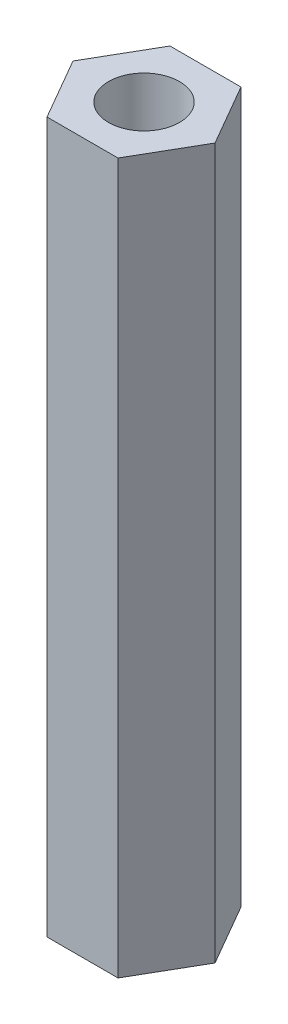
ISO-10303-21;
HEADER;
FILE_DESCRIPTION(('STEP AP214'),'2;1');
FILE_NAME('part.step','',(''),(''),'','','');
FILE_SCHEMA(('AUTOMOTIVE_DESIGN { 1 0 10303 214 1 1 1 1 }'));
ENDSEC;
DATA;
#1=APPLICATION_CONTEXT('core data for automotive mechanical design processes');
#2=APPLICATION_PROTOCOL_DEFINITION('international standard','automotive_design',2000,#1);
#3=PRODUCT_CONTEXT('',#1,'mechanical');
#4=PRODUCT('Part','Part','',(#3));
#5=PRODUCT_RELATED_PRODUCT_CATEGORY('part','',(#4));
#6=PRODUCT_DEFINITION_FORMATION('','',#4);
#7=PRODUCT_DEFINITION_CONTEXT('part definition',#1,'design');
#8=PRODUCT_DEFINITION('design','',#6,#7);
#9=PRODUCT_DEFINITION_SHAPE('','',#8);
#10=(LENGTH_UNIT() NAMED_UNIT(*) SI_UNIT(.MILLI.,.METRE.));
#11=(NAMED_UNIT(*) PLANE_ANGLE_UNIT() SI_UNIT($,.RADIAN.));
#12=(NAMED_UNIT(*) SI_UNIT($,.STERADIAN.) SOLID_ANGLE_UNIT());
#13=UNCERTAINTY_MEASURE_WITH_UNIT(LENGTH_MEASURE(1.E-05),#10,'distance_accuracy_value','');
#14=(GEOMETRIC_REPRESENTATION_CONTEXT(3) GLOBAL_UNCERTAINTY_ASSIGNED_CONTEXT((#13)) GLOBAL_UNIT_ASSIGNED_CONTEXT((#10,
#11,#12)) REPRESENTATION_CONTEXT('',''));
#15=CARTESIAN_POINT('',(0.,0.,0.));
#16=DIRECTION('',(0.,0.,1.));
#17=DIRECTION('',(1.,0.,0.));
#18=AXIS2_PLACEMENT_3D('',#15,#16,#17);
#19=CARTESIAN_POINT('',(0.,30.,0.));
#20=DIRECTION('',(0.,1.,0.));
#21=DIRECTION('',(0.,0.,1.));
#22=AXIS2_PLACEMENT_3D('',#19,#20,#21);
#23=PLANE('',#22);
#24=DIRECTION('',(-0.5,0.,-0.866025403784439));
#25=VECTOR('',#24,1.);
#26=CARTESIAN_POINT('',(3.,30.,0.));
#27=LINE('',#26,#25);
#28=CARTESIAN_POINT('',(3.,30.,0.));
#29=VERTEX_POINT('',#28);
#30=CARTESIAN_POINT('',(1.5,30.,-2.59807621135332));
#31=VERTEX_POINT('',#30);
#32=EDGE_CURVE('E152',#29,#31,#27,.T.);
#33=ORIENTED_EDGE('',*,*,#32,.T.);
#34=DIRECTION('',(-1.,0.,0.));
#35=VECTOR('',#34,1.);
#36=CARTESIAN_POINT('',(1.5,30.,-2.59807621135332));
#37=LINE('',#36,#35);
#38=CARTESIAN_POINT('',(-1.5,30.,-2.59807621135332));
#39=VERTEX_POINT('',#38);
#40=EDGE_CURVE('E100',#31,#39,#37,.T.);
#41=ORIENTED_EDGE('',*,*,#40,.T.);
#42=DIRECTION('',(-0.5,0.,0.866025403784439));
#43=VECTOR('',#42,1.);
#44=CARTESIAN_POINT('',(-1.5,30.,-2.59807621135332));
#45=LINE('',#44,#43);
#46=CARTESIAN_POINT('',(-3.,30.,0.));
#47=VERTEX_POINT('',#46);
#48=EDGE_CURVE('E113',#39,#47,#45,.T.);
#49=ORIENTED_EDGE('',*,*,#48,.T.);
#50=DIRECTION('',(0.5,0.,0.866025403784438));
#51=VECTOR('',#50,1.);
#52=CARTESIAN_POINT('',(-3.,30.,0.));
#53=LINE('',#52,#51);
#54=CARTESIAN_POINT('',(-1.5,30.,2.59807621135332));
#55=VERTEX_POINT('',#54);
#56=EDGE_CURVE('E107',#47,#55,#53,.T.);
#57=ORIENTED_EDGE('',*,*,#56,.T.);
#58=DIRECTION('',(1.,0.,0.));
#59=VECTOR('',#58,1.);
#60=CARTESIAN_POINT('',(-1.5,30.,2.59807621135332));
#61=LINE('',#60,#59);
#62=CARTESIAN_POINT('',(1.5,30.,2.59807621135332));
#63=VERTEX_POINT('',#62);
#64=EDGE_CURVE('E111',#55,#63,#61,.T.);
#65=ORIENTED_EDGE('',*,*,#64,.T.);
#66=DIRECTION('',(0.5,0.,-0.866025403784439));
#67=VECTOR('',#66,1.);
#68=CARTESIAN_POINT('',(1.5,30.,2.59807621135332));
#69=LINE('',#68,#67);
#70=EDGE_CURVE('E63',#63,#29,#69,.T.);
#71=ORIENTED_EDGE('',*,*,#70,.T.);
#72=EDGE_LOOP('',(#33,#41,#49,#57,#65,#71));
#73=FACE_BOUND('',#72,.T.);
#74=CARTESIAN_POINT('',(0.,30.,0.));
#75=DIRECTION('',(0.,1.,0.));
#76=DIRECTION('',(0.,0.,1.));
#77=AXIS2_PLACEMENT_3D('',#74,#75,#76);
#78=CIRCLE('',#77,1.5);
#79=CARTESIAN_POINT('',(0.,30.,1.5));
#80=VERTEX_POINT('',#79);
#81=EDGE_CURVE('E140',#80,#80,#78,.T.);
#82=ORIENTED_EDGE('',*,*,#81,.F.);
#83=EDGE_LOOP('',(#82));
#84=FACE_BOUND('',#83,.T.);
#85=ADVANCED_FACE('F45',(#73,#84),#23,.T.);
#86=CARTESIAN_POINT('',(0.,0.,0.));
#87=DIRECTION('',(0.,1.,0.));
#88=DIRECTION('',(0.,0.,1.));
#89=AXIS2_PLACEMENT_3D('',#86,#87,#88);
#90=PLANE('',#89);
#91=DIRECTION('',(-0.5,0.,-0.866025403784439));
#92=VECTOR('',#91,1.);
#93=CARTESIAN_POINT('',(3.,0.,0.));
#94=LINE('',#93,#92);
#95=CARTESIAN_POINT('',(3.,0.,0.));
#96=VERTEX_POINT('',#95);
#97=CARTESIAN_POINT('',(1.5,0.,-2.59807621135332));
#98=VERTEX_POINT('',#97);
#99=EDGE_CURVE('E135',#96,#98,#94,.T.);
#100=ORIENTED_EDGE('',*,*,#99,.F.);
#101=DIRECTION('',(0.5,0.,-0.866025403784439));
#102=VECTOR('',#101,1.);
#103=CARTESIAN_POINT('',(1.5,0.,2.59807621135332));
#104=LINE('',#103,#102);
#105=CARTESIAN_POINT('',(1.5,0.,2.59807621135332));
#106=VERTEX_POINT('',#105);
#107=EDGE_CURVE('E92',#106,#96,#104,.T.);
#108=ORIENTED_EDGE('',*,*,#107,.F.);
#109=DIRECTION('',(1.,0.,0.));
#110=VECTOR('',#109,1.);
#111=CARTESIAN_POINT('',(-1.5,0.,2.59807621135332));
#112=LINE('',#111,#110);
#113=CARTESIAN_POINT('',(-1.5,0.,2.59807621135332));
#114=VERTEX_POINT('',#113);
#115=EDGE_CURVE('E86',#114,#106,#112,.T.);
#116=ORIENTED_EDGE('',*,*,#115,.F.);
#117=DIRECTION('',(0.5,0.,0.866025403784438));
#118=VECTOR('',#117,1.);
#119=CARTESIAN_POINT('',(-3.,0.,0.));
#120=LINE('',#119,#118);
#121=CARTESIAN_POINT('',(-3.,0.,0.));
#122=VERTEX_POINT('',#121);
#123=EDGE_CURVE('E122',#122,#114,#120,.T.);
#124=ORIENTED_EDGE('',*,*,#123,.F.);
#125=DIRECTION('',(-0.5,0.,0.866025403784439));
#126=VECTOR('',#125,1.);
#127=CARTESIAN_POINT('',(-1.5,0.,-2.59807621135332));
#128=LINE('',#127,#126);
#129=CARTESIAN_POINT('',(-1.5,0.,-2.59807621135332));
#130=VERTEX_POINT('',#129);
#131=EDGE_CURVE('E143',#130,#122,#128,.T.);
#132=ORIENTED_EDGE('',*,*,#131,.F.);
#133=DIRECTION('',(-1.,0.,0.));
#134=VECTOR('',#133,1.);
#135=CARTESIAN_POINT('',(1.5,0.,-2.59807621135332));
#136=LINE('',#135,#134);
#137=EDGE_CURVE('E139',#98,#130,#136,.T.);
#138=ORIENTED_EDGE('',*,*,#137,.F.);
#139=EDGE_LOOP('',(#100,#108,#116,#124,#132,#138));
#140=FACE_BOUND('',#139,.T.);
#141=CARTESIAN_POINT('',(0.,0.,0.));
#142=DIRECTION('',(0.,1.,0.));
#143=DIRECTION('',(0.,0.,1.));
#144=AXIS2_PLACEMENT_3D('',#141,#142,#143);
#145=CIRCLE('',#144,1.5);
#146=CARTESIAN_POINT('',(0.,0.,1.5));
#147=VERTEX_POINT('',#146);
#148=EDGE_CURVE('E249',#147,#147,#145,.T.);
#149=ORIENTED_EDGE('',*,*,#148,.T.);
#150=EDGE_LOOP('',(#149));
#151=FACE_BOUND('',#150,.T.);
#152=ADVANCED_FACE('F165',(#140,#151),#90,.F.);
#153=CARTESIAN_POINT('',(3.,30.,0.));
#154=DIRECTION('',(-0.866025403784439,0.,0.5));
#155=DIRECTION('',(0.5,0.,0.866025403784439));
#156=AXIS2_PLACEMENT_3D('',#153,#154,#155);
#157=PLANE('',#156);
#158=ORIENTED_EDGE('',*,*,#99,.T.);
#159=DIRECTION('',(0.,-1.,0.));
#160=VECTOR('',#159,1.);
#161=CARTESIAN_POINT('',(1.5,30.,-2.59807621135332));
#162=LINE('',#161,#160);
#163=EDGE_CURVE('E11',#31,#98,#162,.T.);
#164=ORIENTED_EDGE('',*,*,#163,.F.);
#165=ORIENTED_EDGE('',*,*,#32,.F.);
#166=DIRECTION('',(0.,-1.,0.));
#167=VECTOR('',#166,1.);
#168=CARTESIAN_POINT('',(3.,30.,0.));
#169=LINE('',#168,#167);
#170=EDGE_CURVE('E131',#29,#96,#169,.T.);
#171=ORIENTED_EDGE('',*,*,#170,.T.);
#172=EDGE_LOOP('',(#158,#164,#165,#171));
#173=FACE_BOUND('',#172,.T.);
#174=ADVANCED_FACE('F47',(#173),#157,.F.);
#175=CARTESIAN_POINT('',(1.5,30.,-2.59807621135332));
#176=DIRECTION('',(0.,0.,1.));
#177=DIRECTION('',(1.,0.,0.));
#178=AXIS2_PLACEMENT_3D('',#175,#176,#177);
#179=PLANE('',#178);
#180=ORIENTED_EDGE('',*,*,#137,.T.);
#181=DIRECTION('',(0.,-1.,0.));
#182=VECTOR('',#181,1.);
#183=CARTESIAN_POINT('',(-1.5,30.,-2.59807621135332));
#184=LINE('',#183,#182);
#185=EDGE_CURVE('E55',#39,#130,#184,.T.);
#186=ORIENTED_EDGE('',*,*,#185,.F.);
#187=ORIENTED_EDGE('',*,*,#40,.F.);
#188=ORIENTED_EDGE('',*,*,#163,.T.);
#189=EDGE_LOOP('',(#180,#186,#187,#188));
#190=FACE_BOUND('',#189,.T.);
#191=ADVANCED_FACE('F190',(#190),#179,.F.);
#192=CARTESIAN_POINT('',(-1.5,30.,-2.59807621135332));
#193=DIRECTION('',(0.866025403784439,0.,0.5));
#194=DIRECTION('',(0.5,0.,-0.866025403784439));
#195=AXIS2_PLACEMENT_3D('',#192,#193,#194);
#196=PLANE('',#195);
#197=ORIENTED_EDGE('',*,*,#131,.T.);
#198=DIRECTION('',(0.,-1.,0.));
#199=VECTOR('',#198,1.);
#200=CARTESIAN_POINT('',(-3.,30.,0.));
#201=LINE('',#200,#199);
#202=EDGE_CURVE('E124',#47,#122,#201,.T.);
#203=ORIENTED_EDGE('',*,*,#202,.F.);
#204=ORIENTED_EDGE('',*,*,#48,.F.);
#205=ORIENTED_EDGE('',*,*,#185,.T.);
#206=EDGE_LOOP('',(#197,#203,#204,#205));
#207=FACE_BOUND('',#206,.T.);
#208=ADVANCED_FACE('F162',(#207),#196,.F.);
#209=CARTESIAN_POINT('',(-3.,30.,0.));
#210=DIRECTION('',(0.866025403784438,0.,-0.5));
#211=DIRECTION('',(-0.500000000000001,0.,-0.866025403784438));
#212=AXIS2_PLACEMENT_3D('',#209,#210,#211);
#213=PLANE('',#212);
#214=ORIENTED_EDGE('',*,*,#123,.T.);
#215=DIRECTION('',(0.,-1.,0.));
#216=VECTOR('',#215,1.);
#217=CARTESIAN_POINT('',(-1.5,30.,2.59807621135332));
#218=LINE('',#217,#216);
#219=EDGE_CURVE('E119',#55,#114,#218,.T.);
#220=ORIENTED_EDGE('',*,*,#219,.F.);
#221=ORIENTED_EDGE('',*,*,#56,.F.);
#222=ORIENTED_EDGE('',*,*,#202,.T.);
#223=EDGE_LOOP('',(#214,#220,#221,#222));
#224=FACE_BOUND('',#223,.T.);
#225=ADVANCED_FACE('F120',(#224),#213,.F.);
#226=CARTESIAN_POINT('',(-1.5,30.,2.59807621135332));
#227=DIRECTION('',(0.,0.,-1.));
#228=DIRECTION('',(-1.,0.,0.));
#229=AXIS2_PLACEMENT_3D('',#226,#227,#228);
#230=PLANE('',#229);
#231=ORIENTED_EDGE('',*,*,#115,.T.);
#232=DIRECTION('',(0.,-1.,0.));
#233=VECTOR('',#232,1.);
#234=CARTESIAN_POINT('',(1.5,30.,2.59807621135332));
#235=LINE('',#234,#233);
#236=EDGE_CURVE('E125',#63,#106,#235,.T.);
#237=ORIENTED_EDGE('',*,*,#236,.F.);
#238=ORIENTED_EDGE('',*,*,#64,.F.);
#239=ORIENTED_EDGE('',*,*,#219,.T.);
#240=EDGE_LOOP('',(#231,#237,#238,#239));
#241=FACE_BOUND('',#240,.T.);
#242=ADVANCED_FACE('F127',(#241),#230,.F.);
#243=CARTESIAN_POINT('',(1.5,30.,2.59807621135332));
#244=DIRECTION('',(-0.866025403784439,0.,-0.5));
#245=DIRECTION('',(-0.5,0.,0.866025403784439));
#246=AXIS2_PLACEMENT_3D('',#243,#244,#245);
#247=PLANE('',#246);
#248=ORIENTED_EDGE('',*,*,#107,.T.);
#249=ORIENTED_EDGE('',*,*,#170,.F.);
#250=ORIENTED_EDGE('',*,*,#70,.F.);
#251=ORIENTED_EDGE('',*,*,#236,.T.);
#252=EDGE_LOOP('',(#248,#249,#250,#251));
#253=FACE_BOUND('',#252,.T.);
#254=ADVANCED_FACE('F170',(#253),#247,.F.);
#255=CARTESIAN_POINT('',(0.,30.,0.));
#256=DIRECTION('',(0.,-1.,0.));
#257=DIRECTION('',(0.,0.,-1.));
#258=AXIS2_PLACEMENT_3D('',#255,#256,#257);
#259=CYLINDRICAL_SURFACE('',#258,1.5);
#260=ORIENTED_EDGE('',*,*,#81,.T.);
#261=EDGE_LOOP('',(#260));
#262=FACE_BOUND('',#261,.T.);
#263=ORIENTED_EDGE('',*,*,#148,.F.);
#264=EDGE_LOOP('',(#263));
#265=FACE_BOUND('',#264,.T.);
#266=ADVANCED_FACE('F172',(#262,#265),#259,.F.);
#267=CLOSED_SHELL('',(#85,#152,#174,#191,#208,#225,#242,#254,#266));
#268=MANIFOLD_SOLID_BREP('B2',#267);
#269=ADVANCED_BREP_SHAPE_REPRESENTATION('',(#18,#268),#14);
#270=SHAPE_DEFINITION_REPRESENTATION(#9,#269);
ENDSEC;
END-ISO-10303-21;
